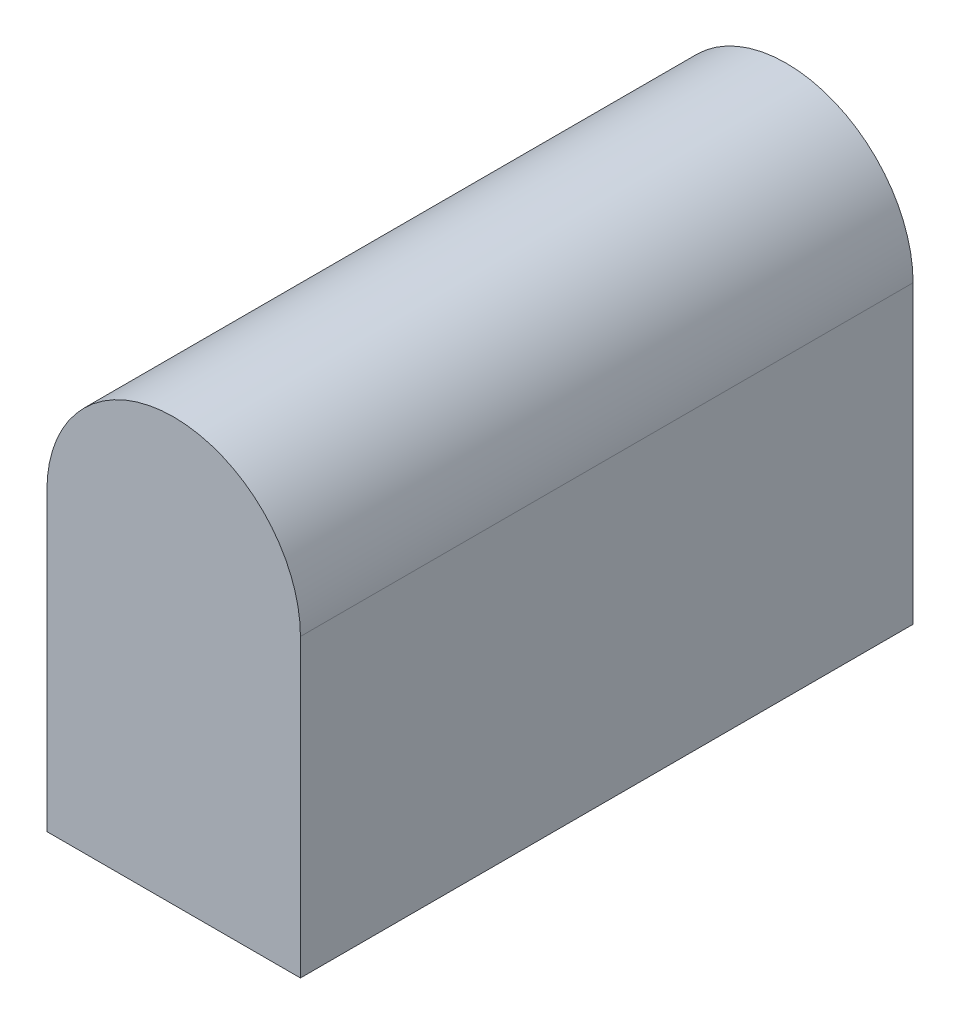
ISO-10303-21;
HEADER;
FILE_DESCRIPTION(('STEP AP214'),'2;1');
FILE_NAME('part.step','',(''),(''),'','','');
FILE_SCHEMA(('AUTOMOTIVE_DESIGN { 1 0 10303 214 1 1 1 1 }'));
ENDSEC;
DATA;
#1=APPLICATION_CONTEXT('core data for automotive mechanical design processes');
#2=APPLICATION_PROTOCOL_DEFINITION('international standard','automotive_design',2000,#1);
#3=PRODUCT_CONTEXT('',#1,'mechanical');
#4=PRODUCT('Part','Part','',(#3));
#5=PRODUCT_RELATED_PRODUCT_CATEGORY('part','',(#4));
#6=PRODUCT_DEFINITION_FORMATION('','',#4);
#7=PRODUCT_DEFINITION_CONTEXT('part definition',#1,'design');
#8=PRODUCT_DEFINITION('design','',#6,#7);
#9=PRODUCT_DEFINITION_SHAPE('','',#8);
#10=(LENGTH_UNIT() NAMED_UNIT(*) SI_UNIT(.MILLI.,.METRE.));
#11=(NAMED_UNIT(*) PLANE_ANGLE_UNIT() SI_UNIT($,.RADIAN.));
#12=(NAMED_UNIT(*) SI_UNIT($,.STERADIAN.) SOLID_ANGLE_UNIT());
#13=UNCERTAINTY_MEASURE_WITH_UNIT(LENGTH_MEASURE(1.E-05),#10,'distance_accuracy_value','');
#14=(GEOMETRIC_REPRESENTATION_CONTEXT(3) GLOBAL_UNCERTAINTY_ASSIGNED_CONTEXT((#13)) GLOBAL_UNIT_ASSIGNED_CONTEXT((#10,
#11,#12)) REPRESENTATION_CONTEXT('',''));
#15=CARTESIAN_POINT('',(0.,0.,0.));
#16=DIRECTION('',(0.,0.,1.));
#17=DIRECTION('',(1.,0.,0.));
#18=AXIS2_PLACEMENT_3D('',#15,#16,#17);
#19=CARTESIAN_POINT('',(-5.80000000000001,3.54551119409911,4.35));
#20=DIRECTION('',(0.,1.,0.));
#21=DIRECTION('',(0.,0.,1.));
#22=AXIS2_PLACEMENT_3D('',#19,#20,#21);
#23=PLANE('',#22);
#24=DIRECTION('',(0.,0.,1.));
#25=VECTOR('',#24,1.);
#26=CARTESIAN_POINT('',(-4.60000000000001,3.54551119409911,4.35));
#27=LINE('',#26,#25);
#28=CARTESIAN_POINT('',(-4.60000000000001,3.54551119409911,1.45));
#29=VERTEX_POINT('',#28);
#30=CARTESIAN_POINT('',(-4.60000000000001,3.54551119409911,4.35));
#31=VERTEX_POINT('',#30);
#32=EDGE_CURVE('E55',#29,#31,#27,.T.);
#33=ORIENTED_EDGE('',*,*,#32,.T.);
#34=DIRECTION('',(-1.,0.,0.));
#35=VECTOR('',#34,1.);
#36=CARTESIAN_POINT('',(-5.20000000000001,3.54551119409911,4.35));
#37=LINE('',#36,#35);
#38=CARTESIAN_POINT('',(-5.80000000000001,3.54551119409911,4.35));
#39=VERTEX_POINT('',#38);
#40=EDGE_CURVE('E65',#31,#39,#37,.T.);
#41=ORIENTED_EDGE('',*,*,#40,.T.);
#42=DIRECTION('',(0.,0.,1.));
#43=VECTOR('',#42,1.);
#44=CARTESIAN_POINT('',(-5.80000000000001,3.54551119409911,4.35));
#45=LINE('',#44,#43);
#46=CARTESIAN_POINT('',(-5.80000000000001,3.54551119409911,1.45));
#47=VERTEX_POINT('',#46);
#48=EDGE_CURVE('E62',#39,#47,#45,.F.);
#49=ORIENTED_EDGE('',*,*,#48,.T.);
#50=DIRECTION('',(-1.,0.,0.));
#51=VECTOR('',#50,1.);
#52=CARTESIAN_POINT('',(-5.20000000000001,3.54551119409911,1.45));
#53=LINE('',#52,#51);
#54=EDGE_CURVE('E64',#29,#47,#53,.T.);
#55=ORIENTED_EDGE('',*,*,#54,.F.);
#56=EDGE_LOOP('',(#33,#41,#49,#55));
#57=FACE_BOUND('',#56,.T.);
#58=ADVANCED_FACE('F17',(#57),#23,.F.);
#59=CARTESIAN_POINT('',(-5.20000000000001,4.94551119409911,1.45));
#60=DIRECTION('',(0.,0.,-1.));
#61=DIRECTION('',(-1.,0.,0.));
#62=AXIS2_PLACEMENT_3D('',#59,#60,#61);
#63=PLANE('',#62);
#64=DIRECTION('',(0.,-1.,0.));
#65=VECTOR('',#64,1.);
#66=CARTESIAN_POINT('',(-4.60000000000001,3.54551119409911,1.45));
#67=LINE('',#66,#65);
#68=CARTESIAN_POINT('',(-4.60000000000001,4.94551119409911,1.45));
#69=VERTEX_POINT('',#68);
#70=EDGE_CURVE('E73',#69,#29,#67,.T.);
#71=ORIENTED_EDGE('',*,*,#70,.T.);
#72=ORIENTED_EDGE('',*,*,#54,.T.);
#73=DIRECTION('',(0.,1.,0.));
#74=VECTOR('',#73,1.);
#75=CARTESIAN_POINT('',(-5.80000000000001,3.54551119409911,1.45));
#76=LINE('',#75,#74);
#77=CARTESIAN_POINT('',(-5.80000000000001,4.94551119409911,1.45));
#78=VERTEX_POINT('',#77);
#79=EDGE_CURVE('E69',#47,#78,#76,.T.);
#80=ORIENTED_EDGE('',*,*,#79,.T.);
#81=CARTESIAN_POINT('',(-5.20000000000001,4.94551119409911,1.45));
#82=DIRECTION('',(0.,0.,1.));
#83=DIRECTION('',(1.,0.,0.));
#84=AXIS2_PLACEMENT_3D('',#81,#82,#83);
#85=CIRCLE('',#84,0.6);
#86=EDGE_CURVE('E20',#69,#78,#85,.T.);
#87=ORIENTED_EDGE('',*,*,#86,.F.);
#88=EDGE_LOOP('',(#71,#72,#80,#87));
#89=FACE_BOUND('',#88,.T.);
#90=ADVANCED_FACE('F71',(#89),#63,.T.);
#91=CARTESIAN_POINT('',(-5.80000000000001,3.54551119409911,4.35));
#92=DIRECTION('',(1.,0.,0.));
#93=DIRECTION('',(0.,1.,0.));
#94=AXIS2_PLACEMENT_3D('',#91,#92,#93);
#95=PLANE('',#94);
#96=ORIENTED_EDGE('',*,*,#48,.F.);
#97=DIRECTION('',(0.,1.,0.));
#98=VECTOR('',#97,1.);
#99=CARTESIAN_POINT('',(-5.80000000000001,4.94551119409911,4.35));
#100=LINE('',#99,#98);
#101=CARTESIAN_POINT('',(-5.80000000000001,4.94551119409911,4.35));
#102=VERTEX_POINT('',#101);
#103=EDGE_CURVE('E79',#39,#102,#100,.T.);
#104=ORIENTED_EDGE('',*,*,#103,.T.);
#105=DIRECTION('',(0.,0.,1.));
#106=VECTOR('',#105,1.);
#107=CARTESIAN_POINT('',(-5.80000000000001,4.94551119409911,4.35));
#108=LINE('',#107,#106);
#109=EDGE_CURVE('E77',#78,#102,#108,.T.);
#110=ORIENTED_EDGE('',*,*,#109,.F.);
#111=ORIENTED_EDGE('',*,*,#79,.F.);
#112=EDGE_LOOP('',(#96,#104,#110,#111));
#113=FACE_BOUND('',#112,.T.);
#114=ADVANCED_FACE('F75',(#113),#95,.F.);
#115=CARTESIAN_POINT('',(-5.20000000000001,4.94551119409911,4.35));
#116=DIRECTION('',(0.,0.,-1.));
#117=DIRECTION('',(-1.,0.,0.));
#118=AXIS2_PLACEMENT_3D('',#115,#116,#117);
#119=PLANE('',#118);
#120=ORIENTED_EDGE('',*,*,#40,.F.);
#121=DIRECTION('',(0.,-1.,0.));
#122=VECTOR('',#121,1.);
#123=CARTESIAN_POINT('',(-4.60000000000001,3.54551119409911,4.35));
#124=LINE('',#123,#122);
#125=CARTESIAN_POINT('',(-4.60000000000001,4.94551119409911,4.35));
#126=VERTEX_POINT('',#125);
#127=EDGE_CURVE('E35',#31,#126,#124,.F.);
#128=ORIENTED_EDGE('',*,*,#127,.T.);
#129=CARTESIAN_POINT('',(-5.20000000000001,4.94551119409911,4.35));
#130=DIRECTION('',(0.,0.,1.));
#131=DIRECTION('',(1.,0.,0.));
#132=AXIS2_PLACEMENT_3D('',#129,#130,#131);
#133=CIRCLE('',#132,0.6);
#134=EDGE_CURVE('E26',#102,#126,#133,.F.);
#135=ORIENTED_EDGE('',*,*,#134,.F.);
#136=ORIENTED_EDGE('',*,*,#103,.F.);
#137=EDGE_LOOP('',(#120,#128,#135,#136));
#138=FACE_BOUND('',#137,.T.);
#139=ADVANCED_FACE('F104',(#138),#119,.F.);
#140=CARTESIAN_POINT('',(-4.60000000000001,3.54551119409911,4.35));
#141=DIRECTION('',(-1.,0.,0.));
#142=DIRECTION('',(0.,-1.,0.));
#143=AXIS2_PLACEMENT_3D('',#140,#141,#142);
#144=PLANE('',#143);
#145=DIRECTION('',(0.,0.,1.));
#146=VECTOR('',#145,1.);
#147=CARTESIAN_POINT('',(-4.60000000000001,4.94551119409911,4.35));
#148=LINE('',#147,#146);
#149=EDGE_CURVE('E11',#126,#69,#148,.F.);
#150=ORIENTED_EDGE('',*,*,#149,.F.);
#151=ORIENTED_EDGE('',*,*,#127,.F.);
#152=ORIENTED_EDGE('',*,*,#32,.F.);
#153=ORIENTED_EDGE('',*,*,#70,.F.);
#154=EDGE_LOOP('',(#150,#151,#152,#153));
#155=FACE_BOUND('',#154,.T.);
#156=ADVANCED_FACE('F106',(#155),#144,.F.);
#157=CARTESIAN_POINT('',(-5.20000000000001,4.94551119409911,4.35));
#158=DIRECTION('',(0.,0.,1.));
#159=DIRECTION('',(1.,0.,0.));
#160=AXIS2_PLACEMENT_3D('',#157,#158,#159);
#161=CYLINDRICAL_SURFACE('',#160,0.6);
#162=ORIENTED_EDGE('',*,*,#134,.T.);
#163=ORIENTED_EDGE('',*,*,#149,.T.);
#164=ORIENTED_EDGE('',*,*,#86,.T.);
#165=ORIENTED_EDGE('',*,*,#109,.T.);
#166=EDGE_LOOP('',(#162,#163,#164,#165));
#167=FACE_BOUND('',#166,.T.);
#168=ADVANCED_FACE('F113',(#167),#161,.T.);
#169=CLOSED_SHELL('',(#58,#90,#114,#139,#156,#168));
#170=MANIFOLD_SOLID_BREP('B1',#169);
#171=ADVANCED_BREP_SHAPE_REPRESENTATION('',(#18,#170),#14);
#172=SHAPE_DEFINITION_REPRESENTATION(#9,#171);
ENDSEC;
END-ISO-10303-21;
